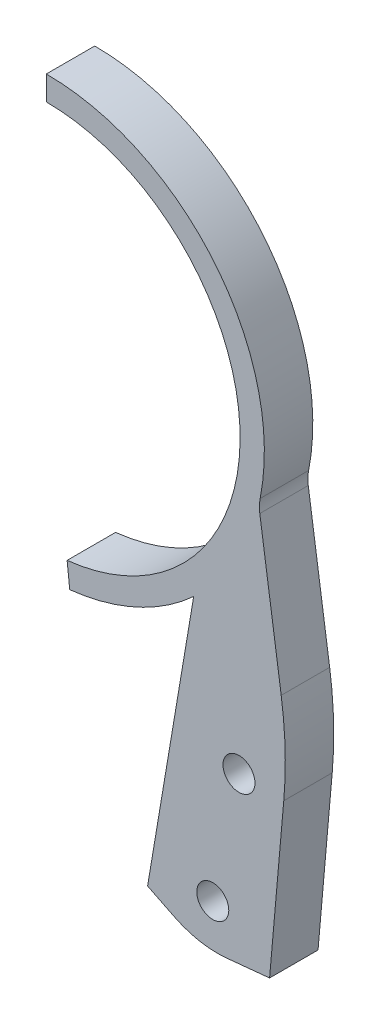
ISO-10303-21;
HEADER;
FILE_DESCRIPTION(('STEP AP214'),'2;1');
FILE_NAME('part.step','',(''),(''),'','','');
FILE_SCHEMA(('AUTOMOTIVE_DESIGN { 1 0 10303 214 1 1 1 1 }'));
ENDSEC;
DATA;
#1=APPLICATION_CONTEXT('core data for automotive mechanical design processes');
#2=APPLICATION_PROTOCOL_DEFINITION('international standard','automotive_design',2000,#1);
#3=PRODUCT_CONTEXT('',#1,'mechanical');
#4=PRODUCT('Part','Part','',(#3));
#5=PRODUCT_RELATED_PRODUCT_CATEGORY('part','',(#4));
#6=PRODUCT_DEFINITION_FORMATION('','',#4);
#7=PRODUCT_DEFINITION_CONTEXT('part definition',#1,'design');
#8=PRODUCT_DEFINITION('design','',#6,#7);
#9=PRODUCT_DEFINITION_SHAPE('','',#8);
#10=(LENGTH_UNIT() NAMED_UNIT(*) SI_UNIT(.MILLI.,.METRE.));
#11=(NAMED_UNIT(*) PLANE_ANGLE_UNIT() SI_UNIT($,.RADIAN.));
#12=(NAMED_UNIT(*) SI_UNIT($,.STERADIAN.) SOLID_ANGLE_UNIT());
#13=UNCERTAINTY_MEASURE_WITH_UNIT(LENGTH_MEASURE(1.E-05),#10,'distance_accuracy_value','');
#14=(GEOMETRIC_REPRESENTATION_CONTEXT(3) GLOBAL_UNCERTAINTY_ASSIGNED_CONTEXT((#13)) GLOBAL_UNIT_ASSIGNED_CONTEXT((#10,
#11,#12)) REPRESENTATION_CONTEXT('',''));
#15=CARTESIAN_POINT('',(0.,0.,0.));
#16=DIRECTION('',(0.,0.,1.));
#17=DIRECTION('',(1.,0.,0.));
#18=AXIS2_PLACEMENT_3D('',#15,#16,#17);
#19=CARTESIAN_POINT('',(-11.5,59.5,5.));
#20=DIRECTION('',(0.,0.,1.));
#21=DIRECTION('',(1.,0.,0.));
#22=AXIS2_PLACEMENT_3D('',#19,#20,#21);
#23=PLANE('',#22);
#24=CARTESIAN_POINT('',(5.67947549244537,16.6837506273747,5.));
#25=DIRECTION('',(0.,0.,1.));
#26=DIRECTION('',(1.,0.,0.));
#27=AXIS2_PLACEMENT_3D('',#24,#25,#26);
#28=CIRCLE('',#27,1.65);
#29=CARTESIAN_POINT('',(7.32947549244537,16.6837506273747,5.));
#30=VERTEX_POINT('',#29);
#31=EDGE_CURVE('E179',#30,#30,#28,.T.);
#32=ORIENTED_EDGE('',*,*,#31,.F.);
#33=EDGE_LOOP('',(#32));
#34=FACE_BOUND('',#33,.T.);
#35=DIRECTION('',(0.896009897531916,-0.444034079238121,0.));
#36=VECTOR('',#35,1.);
#37=CARTESIAN_POINT('',(-1.04711146063493,14.6645750028113,5.));
#38=LINE('',#37,#36);
#39=CARTESIAN_POINT('',(-1.04711146063493,14.6645750028113,5.));
#40=VERTEX_POINT('',#39);
#41=CARTESIAN_POINT('',(1.7101956104969,13.2981410941243,5.));
#42=VERTEX_POINT('',#41);
#43=EDGE_CURVE('E144',#40,#42,#38,.T.);
#44=ORIENTED_EDGE('',*,*,#43,.T.);
#45=CARTESIAN_POINT('',(6.15053640287812,22.2582400694434,5.));
#46=DIRECTION('',(0.,0.,1.));
#47=DIRECTION('',(1.,0.,0.));
#48=AXIS2_PLACEMENT_3D('',#45,#46,#47);
#49=CIRCLE('',#48,10.);
#50=CARTESIAN_POINT('',(7.13156192150099,12.3064769627467,5.));
#51=VERTEX_POINT('',#50);
#52=EDGE_CURVE('E11',#42,#51,#49,.T.);
#53=ORIENTED_EDGE('',*,*,#52,.T.);
#54=DIRECTION('',(0.995176310669676,0.0981025518622871,0.));
#55=VECTOR('',#54,1.);
#56=CARTESIAN_POINT('',(4.27874113591349,12.0252514190201,5.));
#57=LINE('',#56,#55);
#58=CARTESIAN_POINT('',(11.5398939036989,12.7410417853546,5.));
#59=VERTEX_POINT('',#58);
#60=EDGE_CURVE('E134',#51,#59,#57,.T.);
#61=ORIENTED_EDGE('',*,*,#60,.T.);
#62=DIRECTION('',(0.087970275032742,0.996123100179222,0.));
#63=VECTOR('',#62,1.);
#64=CARTESIAN_POINT('',(11.5398939036989,12.7410417853546,5.));
#65=LINE('',#64,#63);
#66=CARTESIAN_POINT('',(13.0029741208637,29.3080924304804,5.));
#67=VERTEX_POINT('',#66);
#68=EDGE_CURVE('E138',#59,#67,#65,.T.);
#69=ORIENTED_EDGE('',*,*,#68,.T.);
#70=CARTESIAN_POINT('',(-26.8419498863051,32.82690343179,5.));
#71=DIRECTION('',(0.,0.,1.));
#72=DIRECTION('',(1.,0.,0.));
#73=AXIS2_PLACEMENT_3D('',#70,#71,#72);
#74=CIRCLE('',#73,40.);
#75=CARTESIAN_POINT('',(12.7393102999379,38.5995840975582,5.));
#76=VERTEX_POINT('',#75);
#77=EDGE_CURVE('E229',#67,#76,#74,.T.);
#78=ORIENTED_EDGE('',*,*,#77,.T.);
#79=DIRECTION('',(-0.144317016644205,0.989531504656075,0.));
#80=VECTOR('',#79,1.);
#81=CARTESIAN_POINT('',(13.414614229585,33.9692603204855,5.));
#82=LINE('',#81,#80);
#83=CARTESIAN_POINT('',(10.5307320772442,53.7430355260251,5.));
#84=VERTEX_POINT('',#83);
#85=EDGE_CURVE('E159',#76,#84,#82,.T.);
#86=ORIENTED_EDGE('',*,*,#85,.T.);
#87=CARTESIAN_POINT('',(14.4888580958685,54.320303592602,5.));
#88=DIRECTION('',(0.,0.,1.));
#89=DIRECTION('',(1.,0.,0.));
#90=AXIS2_PLACEMENT_3D('',#87,#88,#89);
#91=CIRCLE('',#90,4.);
#92=CARTESIAN_POINT('',(10.5660115908317,55.1021445597564,5.));
#93=VERTEX_POINT('',#92);
#94=EDGE_CURVE('E221',#84,#93,#91,.F.);
#95=ORIENTED_EDGE('',*,*,#94,.T.);
#96=CARTESIAN_POINT('',(-11.5,59.5,5.));
#97=DIRECTION('',(0.,0.,1.));
#98=DIRECTION('',(1.,0.,0.));
#99=AXIS2_PLACEMENT_3D('',#96,#97,#98);
#100=CIRCLE('',#99,22.5);
#101=CARTESIAN_POINT('',(-11.5,82.,5.));
#102=VERTEX_POINT('',#101);
#103=EDGE_CURVE('E161',#93,#102,#100,.T.);
#104=ORIENTED_EDGE('',*,*,#103,.T.);
#105=DIRECTION('',(0.,-1.,0.));
#106=VECTOR('',#105,1.);
#107=CARTESIAN_POINT('',(-11.5,79.5,5.));
#108=LINE('',#107,#106);
#109=CARTESIAN_POINT('',(-11.5,79.5,5.));
#110=VERTEX_POINT('',#109);
#111=EDGE_CURVE('E166',#102,#110,#108,.T.);
#112=ORIENTED_EDGE('',*,*,#111,.T.);
#113=CARTESIAN_POINT('',(-11.5,59.5,5.));
#114=DIRECTION('',(0.,0.,-1.));
#115=DIRECTION('',(1.,0.,0.));
#116=AXIS2_PLACEMENT_3D('',#113,#114,#115);
#117=CIRCLE('',#116,20.);
#118=CARTESIAN_POINT('',(-9.34928352182402,39.6159757938564,5.));
#119=VERTEX_POINT('',#118);
#120=EDGE_CURVE('E168',#110,#119,#117,.T.);
#121=ORIENTED_EDGE('',*,*,#120,.T.);
#122=DIRECTION('',(0.1075358239088,-0.994201210307177,0.));
#123=VECTOR('',#122,1.);
#124=CARTESIAN_POINT('',(-9.34928352182402,39.6159757938564,5.));
#125=LINE('',#124,#123);
#126=CARTESIAN_POINT('',(-9.08044396205202,37.1304727680885,5.));
#127=VERTEX_POINT('',#126);
#128=EDGE_CURVE('E170',#119,#127,#125,.T.);
#129=ORIENTED_EDGE('',*,*,#128,.T.);
#130=CARTESIAN_POINT('',(-11.5,59.5,5.));
#131=DIRECTION('',(0.,0.,1.));
#132=DIRECTION('',(1.,0.,0.));
#133=AXIS2_PLACEMENT_3D('',#130,#131,#132);
#134=CIRCLE('',#133,22.5);
#135=CARTESIAN_POINT('',(3.70966057465962,42.9194021457715,5.));
#136=VERTEX_POINT('',#135);
#137=EDGE_CURVE('E172',#127,#136,#134,.T.);
#138=ORIENTED_EDGE('',*,*,#137,.T.);
#139=DIRECTION('',(-0.166016316911046,-0.986123005775289,0.));
#140=VECTOR('',#139,1.);
#141=CARTESIAN_POINT('',(-1.04711146063493,14.6645750028113,5.));
#142=LINE('',#141,#140);
#143=EDGE_CURVE('E174',#136,#40,#142,.T.);
#144=ORIENTED_EDGE('',*,*,#143,.T.);
#145=EDGE_LOOP('',(#44,#53,#61,#69,#78,#86,#95,#104,#112,#121,#129,#138,#144));
#146=FACE_BOUND('',#145,.T.);
#147=CARTESIAN_POINT('',(8.38232747307616,29.3996694369142,5.));
#148=DIRECTION('',(0.,0.,1.));
#149=DIRECTION('',(1.,0.,0.));
#150=AXIS2_PLACEMENT_3D('',#147,#148,#149);
#151=CIRCLE('',#150,1.65);
#152=CARTESIAN_POINT('',(10.0323274730762,29.3996694369142,5.));
#153=VERTEX_POINT('',#152);
#154=EDGE_CURVE('E283',#153,#153,#151,.T.);
#155=ORIENTED_EDGE('',*,*,#154,.F.);
#156=EDGE_LOOP('',(#155));
#157=FACE_BOUND('',#156,.T.);
#158=ADVANCED_FACE('F39',(#34,#146,#157),#23,.T.);
#159=CARTESIAN_POINT('',(-11.5,59.5,0.));
#160=DIRECTION('',(0.,0.,1.));
#161=DIRECTION('',(1.,0.,0.));
#162=AXIS2_PLACEMENT_3D('',#159,#160,#161);
#163=PLANE('',#162);
#164=DIRECTION('',(0.995176310669676,0.0981025518622871,0.));
#165=VECTOR('',#164,1.);
#166=CARTESIAN_POINT('',(4.27874113591349,12.0252514190201,0.));
#167=LINE('',#166,#165);
#168=CARTESIAN_POINT('',(7.13156192150099,12.3064769627467,0.));
#169=VERTEX_POINT('',#168);
#170=CARTESIAN_POINT('',(11.5398939036989,12.7410417853546,0.));
#171=VERTEX_POINT('',#170);
#172=EDGE_CURVE('E149',#169,#171,#167,.T.);
#173=ORIENTED_EDGE('',*,*,#172,.F.);
#174=CARTESIAN_POINT('',(6.15053640287812,22.2582400694434,0.));
#175=DIRECTION('',(0.,0.,1.));
#176=DIRECTION('',(1.,0.,0.));
#177=AXIS2_PLACEMENT_3D('',#174,#175,#176);
#178=CIRCLE('',#177,10.);
#179=CARTESIAN_POINT('',(1.7101956104969,13.2981410941243,0.));
#180=VERTEX_POINT('',#179);
#181=EDGE_CURVE('E61',#169,#180,#178,.F.);
#182=ORIENTED_EDGE('',*,*,#181,.T.);
#183=DIRECTION('',(0.896009897531916,-0.444034079238121,0.));
#184=VECTOR('',#183,1.);
#185=CARTESIAN_POINT('',(-1.04711146063493,14.6645750028113,0.));
#186=LINE('',#185,#184);
#187=CARTESIAN_POINT('',(-1.04711146063493,14.6645750028113,0.));
#188=VERTEX_POINT('',#187);
#189=EDGE_CURVE('E177',#188,#180,#186,.T.);
#190=ORIENTED_EDGE('',*,*,#189,.F.);
#191=DIRECTION('',(-0.166016316911046,-0.986123005775289,0.));
#192=VECTOR('',#191,1.);
#193=CARTESIAN_POINT('',(-1.04711146063493,14.6645750028113,0.));
#194=LINE('',#193,#192);
#195=CARTESIAN_POINT('',(3.70966057465962,42.9194021457715,0.));
#196=VERTEX_POINT('',#195);
#197=EDGE_CURVE('E195',#196,#188,#194,.T.);
#198=ORIENTED_EDGE('',*,*,#197,.F.);
#199=CARTESIAN_POINT('',(-11.5,59.5,0.));
#200=DIRECTION('',(0.,0.,1.));
#201=DIRECTION('',(1.,0.,0.));
#202=AXIS2_PLACEMENT_3D('',#199,#200,#201);
#203=CIRCLE('',#202,22.5);
#204=CARTESIAN_POINT('',(-9.08044396205202,37.1304727680885,0.));
#205=VERTEX_POINT('',#204);
#206=EDGE_CURVE('E193',#205,#196,#203,.T.);
#207=ORIENTED_EDGE('',*,*,#206,.F.);
#208=DIRECTION('',(0.1075358239088,-0.994201210307177,0.));
#209=VECTOR('',#208,1.);
#210=CARTESIAN_POINT('',(-9.34928352182402,39.6159757938564,0.));
#211=LINE('',#210,#209);
#212=CARTESIAN_POINT('',(-9.34928352182402,39.6159757938564,0.));
#213=VERTEX_POINT('',#212);
#214=EDGE_CURVE('E191',#213,#205,#211,.T.);
#215=ORIENTED_EDGE('',*,*,#214,.F.);
#216=CARTESIAN_POINT('',(-11.5,59.5,0.));
#217=DIRECTION('',(0.,0.,-1.));
#218=DIRECTION('',(1.,0.,0.));
#219=AXIS2_PLACEMENT_3D('',#216,#217,#218);
#220=CIRCLE('',#219,20.);
#221=CARTESIAN_POINT('',(-11.5,79.5,0.));
#222=VERTEX_POINT('',#221);
#223=EDGE_CURVE('E189',#222,#213,#220,.T.);
#224=ORIENTED_EDGE('',*,*,#223,.F.);
#225=DIRECTION('',(0.,-1.,0.));
#226=VECTOR('',#225,1.);
#227=CARTESIAN_POINT('',(-11.5,79.5,0.));
#228=LINE('',#227,#226);
#229=CARTESIAN_POINT('',(-11.5,82.,0.));
#230=VERTEX_POINT('',#229);
#231=EDGE_CURVE('E187',#230,#222,#228,.T.);
#232=ORIENTED_EDGE('',*,*,#231,.F.);
#233=CARTESIAN_POINT('',(-11.5,59.5,0.));
#234=DIRECTION('',(0.,0.,1.));
#235=DIRECTION('',(1.,0.,0.));
#236=AXIS2_PLACEMENT_3D('',#233,#234,#235);
#237=CIRCLE('',#236,22.5);
#238=CARTESIAN_POINT('',(10.5660115908317,55.1021445597564,0.));
#239=VERTEX_POINT('',#238);
#240=EDGE_CURVE('E185',#239,#230,#237,.T.);
#241=ORIENTED_EDGE('',*,*,#240,.F.);
#242=CARTESIAN_POINT('',(14.4888580958685,54.320303592602,0.));
#243=DIRECTION('',(0.,0.,1.));
#244=DIRECTION('',(1.,0.,0.));
#245=AXIS2_PLACEMENT_3D('',#242,#243,#244);
#246=CIRCLE('',#245,4.);
#247=CARTESIAN_POINT('',(10.5307320772442,53.7430355260251,0.));
#248=VERTEX_POINT('',#247);
#249=EDGE_CURVE('E218',#239,#248,#246,.T.);
#250=ORIENTED_EDGE('',*,*,#249,.T.);
#251=DIRECTION('',(-0.144317016644205,0.989531504656075,0.));
#252=VECTOR('',#251,1.);
#253=CARTESIAN_POINT('',(13.414614229585,33.9692603204855,0.));
#254=LINE('',#253,#252);
#255=CARTESIAN_POINT('',(12.7393102999379,38.5995840975582,0.));
#256=VERTEX_POINT('',#255);
#257=EDGE_CURVE('E183',#256,#248,#254,.T.);
#258=ORIENTED_EDGE('',*,*,#257,.F.);
#259=CARTESIAN_POINT('',(-26.8419498863051,32.82690343179,0.));
#260=DIRECTION('',(0.,0.,1.));
#261=DIRECTION('',(1.,0.,0.));
#262=AXIS2_PLACEMENT_3D('',#259,#260,#261);
#263=CIRCLE('',#262,40.);
#264=CARTESIAN_POINT('',(13.0029741208637,29.3080924304804,0.));
#265=VERTEX_POINT('',#264);
#266=EDGE_CURVE('E226',#256,#265,#263,.F.);
#267=ORIENTED_EDGE('',*,*,#266,.T.);
#268=DIRECTION('',(0.087970275032742,0.996123100179222,0.));
#269=VECTOR('',#268,1.);
#270=CARTESIAN_POINT('',(11.5398939036989,12.7410417853546,0.));
#271=LINE('',#270,#269);
#272=EDGE_CURVE('E181',#171,#265,#271,.T.);
#273=ORIENTED_EDGE('',*,*,#272,.F.);
#274=EDGE_LOOP('',(#173,#182,#190,#198,#207,#215,#224,#232,#241,#250,#258,#267,#273));
#275=FACE_BOUND('',#274,.T.);
#276=CARTESIAN_POINT('',(5.67947549244537,16.6837506273747,0.));
#277=DIRECTION('',(0.,0.,1.));
#278=DIRECTION('',(1.,0.,0.));
#279=AXIS2_PLACEMENT_3D('',#276,#277,#278);
#280=CIRCLE('',#279,1.65);
#281=CARTESIAN_POINT('',(7.32947549244537,16.6837506273747,0.));
#282=VERTEX_POINT('',#281);
#283=EDGE_CURVE('E280',#282,#282,#280,.T.);
#284=ORIENTED_EDGE('',*,*,#283,.T.);
#285=EDGE_LOOP('',(#284));
#286=FACE_BOUND('',#285,.T.);
#287=CARTESIAN_POINT('',(8.38232747307616,29.3996694369142,0.));
#288=DIRECTION('',(0.,0.,1.));
#289=DIRECTION('',(1.,0.,0.));
#290=AXIS2_PLACEMENT_3D('',#287,#288,#289);
#291=CIRCLE('',#290,1.65);
#292=CARTESIAN_POINT('',(10.0323274730762,29.3996694369142,0.));
#293=VERTEX_POINT('',#292);
#294=EDGE_CURVE('E286',#293,#293,#291,.T.);
#295=ORIENTED_EDGE('',*,*,#294,.T.);
#296=EDGE_LOOP('',(#295));
#297=FACE_BOUND('',#296,.T.);
#298=ADVANCED_FACE('F234',(#275,#286,#297),#163,.F.);
#299=CARTESIAN_POINT('',(-1.04711146063493,14.6645750028113,5.));
#300=DIRECTION('',(0.444034079238121,0.896009897531916,0.));
#301=DIRECTION('',(-0.896009897531916,0.444034079238121,0.));
#302=AXIS2_PLACEMENT_3D('',#299,#300,#301);
#303=PLANE('',#302);
#304=ORIENTED_EDGE('',*,*,#189,.T.);
#305=DIRECTION('',(0.,0.,-1.));
#306=VECTOR('',#305,1.);
#307=CARTESIAN_POINT('',(1.7101956104969,13.2981410941243,5.));
#308=LINE('',#307,#306);
#309=EDGE_CURVE('E47',#180,#42,#308,.F.);
#310=ORIENTED_EDGE('',*,*,#309,.T.);
#311=ORIENTED_EDGE('',*,*,#43,.F.);
#312=DIRECTION('',(0.,0.,-1.));
#313=VECTOR('',#312,1.);
#314=CARTESIAN_POINT('',(-1.04711146063493,14.6645750028113,5.));
#315=LINE('',#314,#313);
#316=EDGE_CURVE('E176',#40,#188,#315,.T.);
#317=ORIENTED_EDGE('',*,*,#316,.T.);
#318=EDGE_LOOP('',(#304,#310,#311,#317));
#319=FACE_BOUND('',#318,.T.);
#320=ADVANCED_FACE('F278',(#319),#303,.F.);
#321=CARTESIAN_POINT('',(4.27874113591349,12.0252514190201,5.));
#322=DIRECTION('',(-0.0981025518622871,0.995176310669676,0.));
#323=DIRECTION('',(-0.995176310669676,-0.0981025518622871,0.));
#324=AXIS2_PLACEMENT_3D('',#321,#322,#323);
#325=PLANE('',#324);
#326=ORIENTED_EDGE('',*,*,#60,.F.);
#327=DIRECTION('',(0.,0.,-1.));
#328=VECTOR('',#327,1.);
#329=CARTESIAN_POINT('',(7.13156192150099,12.3064769627467,5.));
#330=LINE('',#329,#328);
#331=EDGE_CURVE('E231',#51,#169,#330,.T.);
#332=ORIENTED_EDGE('',*,*,#331,.T.);
#333=ORIENTED_EDGE('',*,*,#172,.T.);
#334=DIRECTION('',(0.,0.,-1.));
#335=VECTOR('',#334,1.);
#336=CARTESIAN_POINT('',(11.5398939036989,12.7410417853546,5.));
#337=LINE('',#336,#335);
#338=EDGE_CURVE('E147',#59,#171,#337,.T.);
#339=ORIENTED_EDGE('',*,*,#338,.F.);
#340=EDGE_LOOP('',(#326,#332,#333,#339));
#341=FACE_BOUND('',#340,.T.);
#342=ADVANCED_FACE('F148',(#341),#325,.F.);
#343=CARTESIAN_POINT('',(11.5398939036989,12.7410417853546,5.));
#344=DIRECTION('',(-0.996123100179222,0.087970275032742,0.));
#345=DIRECTION('',(-0.087970275032742,-0.996123100179222,0.));
#346=AXIS2_PLACEMENT_3D('',#343,#344,#345);
#347=PLANE('',#346);
#348=ORIENTED_EDGE('',*,*,#272,.T.);
#349=DIRECTION('',(0.,0.,-1.));
#350=VECTOR('',#349,1.);
#351=CARTESIAN_POINT('',(13.0029741208637,29.3080924304804,5.));
#352=LINE('',#351,#350);
#353=EDGE_CURVE('E158',#265,#67,#352,.F.);
#354=ORIENTED_EDGE('',*,*,#353,.T.);
#355=ORIENTED_EDGE('',*,*,#68,.F.);
#356=ORIENTED_EDGE('',*,*,#338,.T.);
#357=EDGE_LOOP('',(#348,#354,#355,#356));
#358=FACE_BOUND('',#357,.T.);
#359=ADVANCED_FACE('F156',(#358),#347,.F.);
#360=CARTESIAN_POINT('',(13.414614229585,33.9692603204855,5.));
#361=DIRECTION('',(-0.989531504656075,-0.144317016644205,0.));
#362=DIRECTION('',(0.144317016644205,-0.989531504656075,0.));
#363=AXIS2_PLACEMENT_3D('',#360,#361,#362);
#364=PLANE('',#363);
#365=ORIENTED_EDGE('',*,*,#85,.F.);
#366=DIRECTION('',(0.,0.,-1.));
#367=VECTOR('',#366,1.);
#368=CARTESIAN_POINT('',(12.7393102999379,38.5995840975582,5.));
#369=LINE('',#368,#367);
#370=EDGE_CURVE('E223',#76,#256,#369,.T.);
#371=ORIENTED_EDGE('',*,*,#370,.T.);
#372=ORIENTED_EDGE('',*,*,#257,.T.);
#373=DIRECTION('',(0.,0.,1.));
#374=VECTOR('',#373,1.);
#375=CARTESIAN_POINT('',(10.5307320772442,53.7430355260251,5.));
#376=LINE('',#375,#374);
#377=EDGE_CURVE('E215',#248,#84,#376,.T.);
#378=ORIENTED_EDGE('',*,*,#377,.T.);
#379=EDGE_LOOP('',(#365,#371,#372,#378));
#380=FACE_BOUND('',#379,.T.);
#381=ADVANCED_FACE('F242',(#380),#364,.F.);
#382=CARTESIAN_POINT('',(-11.5,59.5,5.));
#383=DIRECTION('',(0.,0.,-1.));
#384=DIRECTION('',(-1.,0.,0.));
#385=AXIS2_PLACEMENT_3D('',#382,#383,#384);
#386=CYLINDRICAL_SURFACE('',#385,22.5);
#387=ORIENTED_EDGE('',*,*,#103,.F.);
#388=DIRECTION('',(0.,0.,-1.));
#389=VECTOR('',#388,1.);
#390=CARTESIAN_POINT('',(10.5660115908317,55.1021445597564,5.));
#391=LINE('',#390,#389);
#392=EDGE_CURVE('E153',#93,#239,#391,.T.);
#393=ORIENTED_EDGE('',*,*,#392,.T.);
#394=ORIENTED_EDGE('',*,*,#240,.T.);
#395=DIRECTION('',(0.,0.,-1.));
#396=VECTOR('',#395,1.);
#397=CARTESIAN_POINT('',(-11.5,82.,5.));
#398=LINE('',#397,#396);
#399=EDGE_CURVE('E154',#102,#230,#398,.T.);
#400=ORIENTED_EDGE('',*,*,#399,.F.);
#401=EDGE_LOOP('',(#387,#393,#394,#400));
#402=FACE_BOUND('',#401,.T.);
#403=ADVANCED_FACE('F251',(#402),#386,.T.);
#404=CARTESIAN_POINT('',(-11.5,79.5,5.));
#405=DIRECTION('',(1.,0.,0.));
#406=DIRECTION('',(0.,1.,0.));
#407=AXIS2_PLACEMENT_3D('',#404,#405,#406);
#408=PLANE('',#407);
#409=ORIENTED_EDGE('',*,*,#231,.T.);
#410=DIRECTION('',(0.,0.,-1.));
#411=VECTOR('',#410,1.);
#412=CARTESIAN_POINT('',(-11.5,79.5,5.));
#413=LINE('',#412,#411);
#414=EDGE_CURVE('E208',#110,#222,#413,.T.);
#415=ORIENTED_EDGE('',*,*,#414,.F.);
#416=ORIENTED_EDGE('',*,*,#111,.F.);
#417=ORIENTED_EDGE('',*,*,#399,.T.);
#418=EDGE_LOOP('',(#409,#415,#416,#417));
#419=FACE_BOUND('',#418,.T.);
#420=ADVANCED_FACE('F257',(#419),#408,.F.);
#421=CARTESIAN_POINT('',(-11.5,59.5,5.));
#422=DIRECTION('',(0.,0.,-1.));
#423=DIRECTION('',(-1.,0.,0.));
#424=AXIS2_PLACEMENT_3D('',#421,#422,#423);
#425=CYLINDRICAL_SURFACE('',#424,20.);
#426=ORIENTED_EDGE('',*,*,#223,.T.);
#427=DIRECTION('',(0.,0.,-1.));
#428=VECTOR('',#427,1.);
#429=CARTESIAN_POINT('',(-9.34928352182402,39.6159757938564,5.));
#430=LINE('',#429,#428);
#431=EDGE_CURVE('E205',#119,#213,#430,.T.);
#432=ORIENTED_EDGE('',*,*,#431,.F.);
#433=ORIENTED_EDGE('',*,*,#120,.F.);
#434=ORIENTED_EDGE('',*,*,#414,.T.);
#435=EDGE_LOOP('',(#426,#432,#433,#434));
#436=FACE_BOUND('',#435,.T.);
#437=ADVANCED_FACE('F263',(#436),#425,.F.);
#438=CARTESIAN_POINT('',(-9.34928352182402,39.6159757938564,5.));
#439=DIRECTION('',(0.994201210307177,0.1075358239088,0.));
#440=DIRECTION('',(-0.1075358239088,0.994201210307177,0.));
#441=AXIS2_PLACEMENT_3D('',#438,#439,#440);
#442=PLANE('',#441);
#443=ORIENTED_EDGE('',*,*,#214,.T.);
#444=DIRECTION('',(0.,0.,-1.));
#445=VECTOR('',#444,1.);
#446=CARTESIAN_POINT('',(-9.08044396205202,37.1304727680885,5.));
#447=LINE('',#446,#445);
#448=EDGE_CURVE('E202',#127,#205,#447,.T.);
#449=ORIENTED_EDGE('',*,*,#448,.F.);
#450=ORIENTED_EDGE('',*,*,#128,.F.);
#451=ORIENTED_EDGE('',*,*,#431,.T.);
#452=EDGE_LOOP('',(#443,#449,#450,#451));
#453=FACE_BOUND('',#452,.T.);
#454=ADVANCED_FACE('F267',(#453),#442,.F.);
#455=CARTESIAN_POINT('',(-11.5,59.5,5.));
#456=DIRECTION('',(0.,0.,-1.));
#457=DIRECTION('',(-1.,0.,0.));
#458=AXIS2_PLACEMENT_3D('',#455,#456,#457);
#459=CYLINDRICAL_SURFACE('',#458,22.5);
#460=ORIENTED_EDGE('',*,*,#206,.T.);
#461=DIRECTION('',(0.,0.,-1.));
#462=VECTOR('',#461,1.);
#463=CARTESIAN_POINT('',(3.70966057465962,42.9194021457715,5.));
#464=LINE('',#463,#462);
#465=EDGE_CURVE('E199',#136,#196,#464,.T.);
#466=ORIENTED_EDGE('',*,*,#465,.F.);
#467=ORIENTED_EDGE('',*,*,#137,.F.);
#468=ORIENTED_EDGE('',*,*,#448,.T.);
#469=EDGE_LOOP('',(#460,#466,#467,#468));
#470=FACE_BOUND('',#469,.T.);
#471=ADVANCED_FACE('F272',(#470),#459,.T.);
#472=CARTESIAN_POINT('',(-1.04711146063493,14.6645750028113,5.));
#473=DIRECTION('',(0.986123005775289,-0.166016316911046,0.));
#474=DIRECTION('',(0.166016316911046,0.986123005775289,0.));
#475=AXIS2_PLACEMENT_3D('',#472,#473,#474);
#476=PLANE('',#475);
#477=ORIENTED_EDGE('',*,*,#197,.T.);
#478=ORIENTED_EDGE('',*,*,#316,.F.);
#479=ORIENTED_EDGE('',*,*,#143,.F.);
#480=ORIENTED_EDGE('',*,*,#465,.T.);
#481=EDGE_LOOP('',(#477,#478,#479,#480));
#482=FACE_BOUND('',#481,.T.);
#483=ADVANCED_FACE('F276',(#482),#476,.F.);
#484=CARTESIAN_POINT('',(5.67947549244537,16.6837506273747,5.));
#485=DIRECTION('',(0.,0.,-1.));
#486=DIRECTION('',(-1.,0.,0.));
#487=AXIS2_PLACEMENT_3D('',#484,#485,#486);
#488=CYLINDRICAL_SURFACE('',#487,1.65);
#489=ORIENTED_EDGE('',*,*,#31,.T.);
#490=EDGE_LOOP('',(#489));
#491=FACE_BOUND('',#490,.T.);
#492=ORIENTED_EDGE('',*,*,#283,.F.);
#493=EDGE_LOOP('',(#492));
#494=FACE_BOUND('',#493,.T.);
#495=ADVANCED_FACE('F303',(#491,#494),#488,.F.);
#496=CARTESIAN_POINT('',(8.38232747307616,29.3996694369142,5.));
#497=DIRECTION('',(0.,0.,-1.));
#498=DIRECTION('',(-1.,0.,0.));
#499=AXIS2_PLACEMENT_3D('',#496,#497,#498);
#500=CYLINDRICAL_SURFACE('',#499,1.65);
#501=ORIENTED_EDGE('',*,*,#154,.T.);
#502=EDGE_LOOP('',(#501));
#503=FACE_BOUND('',#502,.T.);
#504=ORIENTED_EDGE('',*,*,#294,.F.);
#505=EDGE_LOOP('',(#504));
#506=FACE_BOUND('',#505,.T.);
#507=ADVANCED_FACE('F292',(#503,#506),#500,.F.);
#508=CARTESIAN_POINT('',(14.4888580958685,54.320303592602,5.));
#509=DIRECTION('',(0.,0.,-1.));
#510=DIRECTION('',(-1.,0.,0.));
#511=AXIS2_PLACEMENT_3D('',#508,#509,#510);
#512=CYLINDRICAL_SURFACE('',#511,4.);
#513=ORIENTED_EDGE('',*,*,#94,.F.);
#514=ORIENTED_EDGE('',*,*,#377,.F.);
#515=ORIENTED_EDGE('',*,*,#249,.F.);
#516=ORIENTED_EDGE('',*,*,#392,.F.);
#517=EDGE_LOOP('',(#513,#514,#515,#516));
#518=FACE_BOUND('',#517,.T.);
#519=ADVANCED_FACE('F247',(#518),#512,.F.);
#520=CARTESIAN_POINT('',(-26.8419498863051,32.82690343179,5.));
#521=DIRECTION('',(0.,0.,-1.));
#522=DIRECTION('',(-1.,0.,0.));
#523=AXIS2_PLACEMENT_3D('',#520,#521,#522);
#524=CYLINDRICAL_SURFACE('',#523,40.);
#525=ORIENTED_EDGE('',*,*,#77,.F.);
#526=ORIENTED_EDGE('',*,*,#353,.F.);
#527=ORIENTED_EDGE('',*,*,#266,.F.);
#528=ORIENTED_EDGE('',*,*,#370,.F.);
#529=EDGE_LOOP('',(#525,#526,#527,#528));
#530=FACE_BOUND('',#529,.T.);
#531=ADVANCED_FACE('F238',(#530),#524,.T.);
#532=CARTESIAN_POINT('',(6.15053640287812,22.2582400694434,5.));
#533=DIRECTION('',(0.,0.,-1.));
#534=DIRECTION('',(-1.,0.,0.));
#535=AXIS2_PLACEMENT_3D('',#532,#533,#534);
#536=CYLINDRICAL_SURFACE('',#535,10.);
#537=ORIENTED_EDGE('',*,*,#52,.F.);
#538=ORIENTED_EDGE('',*,*,#309,.F.);
#539=ORIENTED_EDGE('',*,*,#181,.F.);
#540=ORIENTED_EDGE('',*,*,#331,.F.);
#541=EDGE_LOOP('',(#537,#538,#539,#540));
#542=FACE_BOUND('',#541,.T.);
#543=ADVANCED_FACE('F41',(#542),#536,.T.);
#544=CLOSED_SHELL('',(#158,#298,#320,#342,#359,#381,#403,#420,#437,#454,#471,#483,#495,#507,
#519,#531,#543));
#545=MANIFOLD_SOLID_BREP('B2',#544);
#546=ADVANCED_BREP_SHAPE_REPRESENTATION('',(#18,#545),#14);
#547=SHAPE_DEFINITION_REPRESENTATION(#9,#546);
ENDSEC;
END-ISO-10303-21;
